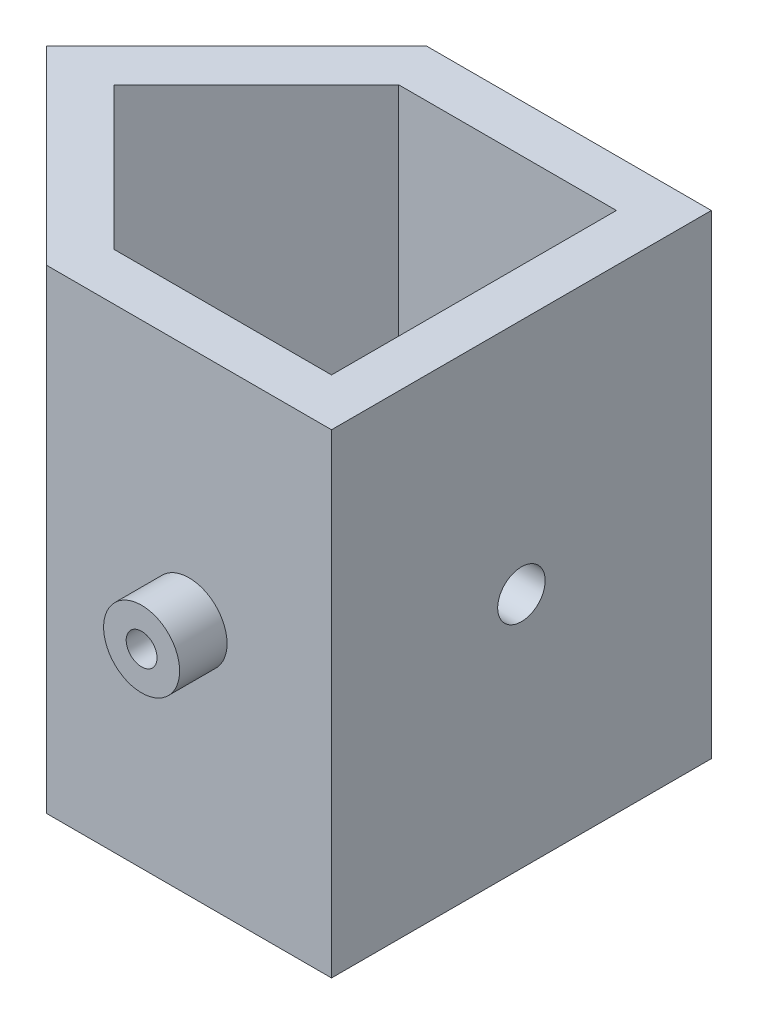
ISO-10303-21;
HEADER;
FILE_DESCRIPTION(('STEP AP214'),'2;1');
FILE_NAME('part.step','',(''),(''),'','','');
FILE_SCHEMA(('AUTOMOTIVE_DESIGN { 1 0 10303 214 1 1 1 1 }'));
ENDSEC;
DATA;
#1=APPLICATION_CONTEXT('core data for automotive mechanical design processes');
#2=APPLICATION_PROTOCOL_DEFINITION('international standard','automotive_design',2000,#1);
#3=PRODUCT_CONTEXT('',#1,'mechanical');
#4=PRODUCT('Part','Part','',(#3));
#5=PRODUCT_RELATED_PRODUCT_CATEGORY('part','',(#4));
#6=PRODUCT_DEFINITION_FORMATION('','',#4);
#7=PRODUCT_DEFINITION_CONTEXT('part definition',#1,'design');
#8=PRODUCT_DEFINITION('design','',#6,#7);
#9=PRODUCT_DEFINITION_SHAPE('','',#8);
#10=(LENGTH_UNIT() NAMED_UNIT(*) SI_UNIT(.MILLI.,.METRE.));
#11=(NAMED_UNIT(*) PLANE_ANGLE_UNIT() SI_UNIT($,.RADIAN.));
#12=(NAMED_UNIT(*) SI_UNIT($,.STERADIAN.) SOLID_ANGLE_UNIT());
#13=UNCERTAINTY_MEASURE_WITH_UNIT(LENGTH_MEASURE(1.E-05),#10,'distance_accuracy_value','');
#14=(GEOMETRIC_REPRESENTATION_CONTEXT(3) GLOBAL_UNCERTAINTY_ASSIGNED_CONTEXT((#13)) GLOBAL_UNIT_ASSIGNED_CONTEXT((#10,
#11,#12)) REPRESENTATION_CONTEXT('',''));
#15=CARTESIAN_POINT('',(0.,0.,0.));
#16=DIRECTION('',(0.,0.,1.));
#17=DIRECTION('',(1.,0.,0.));
#18=AXIS2_PLACEMENT_3D('',#15,#16,#17);
#19=CARTESIAN_POINT('',(20.0000000035894,50.,20.));
#20=DIRECTION('',(-0.707106781123095,0.,0.70710678125));
#21=DIRECTION('',(0.70710678125,0.,0.707106781123095));
#22=AXIS2_PLACEMENT_3D('',#19,#20,#21);
#23=PLANE('',#22);
#24=DIRECTION('',(-0.70710678125,0.,-0.707106781123095));
#25=VECTOR('',#24,1.);
#26=CARTESIAN_POINT('',(20.0000000035894,0.,20.));
#27=LINE('',#26,#25);
#28=CARTESIAN_POINT('',(20.0000000035894,0.,20.));
#29=VERTEX_POINT('',#28);
#30=CARTESIAN_POINT('',(0.,0.,0.));
#31=VERTEX_POINT('',#30);
#32=EDGE_CURVE('E182',#29,#31,#27,.T.);
#33=ORIENTED_EDGE('',*,*,#32,.F.);
#34=DIRECTION('',(0.,-1.,0.));
#35=VECTOR('',#34,1.);
#36=CARTESIAN_POINT('',(20.0000000035894,50.,20.));
#37=LINE('',#36,#35);
#38=CARTESIAN_POINT('',(20.0000000035894,50.,20.));
#39=VERTEX_POINT('',#38);
#40=EDGE_CURVE('E12',#39,#29,#37,.T.);
#41=ORIENTED_EDGE('',*,*,#40,.F.);
#42=DIRECTION('',(-0.70710678125,0.,-0.707106781123095));
#43=VECTOR('',#42,1.);
#44=CARTESIAN_POINT('',(20.0000000035894,50.,20.));
#45=LINE('',#44,#43);
#46=CARTESIAN_POINT('',(0.,50.,0.));
#47=VERTEX_POINT('',#46);
#48=EDGE_CURVE('E188',#39,#47,#45,.T.);
#49=ORIENTED_EDGE('',*,*,#48,.T.);
#50=DIRECTION('',(0.,-1.,0.));
#51=VECTOR('',#50,1.);
#52=CARTESIAN_POINT('',(0.,50.,0.));
#53=LINE('',#52,#51);
#54=EDGE_CURVE('E65',#47,#31,#53,.T.);
#55=ORIENTED_EDGE('',*,*,#54,.T.);
#56=EDGE_LOOP('',(#33,#41,#49,#55));
#57=FACE_BOUND('',#56,.T.);
#58=ADVANCED_FACE('F62',(#57),#23,.T.);
#59=CARTESIAN_POINT('',(50.0000000035894,50.,20.));
#60=DIRECTION('',(0.,0.,1.));
#61=DIRECTION('',(1.,0.,0.));
#62=AXIS2_PLACEMENT_3D('',#59,#60,#61);
#63=PLANE('',#62);
#64=CARTESIAN_POINT('',(35.0000000035894,25.,20.));
#65=DIRECTION('',(0.,0.,1.));
#66=DIRECTION('',(1.,0.,0.));
#67=AXIS2_PLACEMENT_3D('',#64,#65,#66);
#68=CIRCLE('',#67,4.00000000000001);
#69=CARTESIAN_POINT('',(39.0000000035894,25.,20.));
#70=VERTEX_POINT('',#69);
#71=EDGE_CURVE('E444',#70,#70,#68,.T.);
#72=ORIENTED_EDGE('',*,*,#71,.F.);
#73=EDGE_LOOP('',(#72));
#74=FACE_BOUND('',#73,.T.);
#75=DIRECTION('',(-1.,0.,0.));
#76=VECTOR('',#75,1.);
#77=CARTESIAN_POINT('',(50.0000000035894,0.,20.));
#78=LINE('',#77,#76);
#79=CARTESIAN_POINT('',(50.0000000035894,0.,20.));
#80=VERTEX_POINT('',#79);
#81=EDGE_CURVE('E192',#80,#29,#78,.T.);
#82=ORIENTED_EDGE('',*,*,#81,.F.);
#83=DIRECTION('',(0.,-1.,0.));
#84=VECTOR('',#83,1.);
#85=CARTESIAN_POINT('',(50.0000000035894,50.,20.));
#86=LINE('',#85,#84);
#87=CARTESIAN_POINT('',(50.0000000035894,50.,20.));
#88=VERTEX_POINT('',#87);
#89=EDGE_CURVE('E70',#88,#80,#86,.T.);
#90=ORIENTED_EDGE('',*,*,#89,.F.);
#91=DIRECTION('',(-1.,0.,0.));
#92=VECTOR('',#91,1.);
#93=CARTESIAN_POINT('',(50.0000000035894,50.,20.));
#94=LINE('',#93,#92);
#95=EDGE_CURVE('E201',#88,#39,#94,.T.);
#96=ORIENTED_EDGE('',*,*,#95,.T.);
#97=ORIENTED_EDGE('',*,*,#40,.T.);
#98=EDGE_LOOP('',(#82,#90,#96,#97));
#99=FACE_BOUND('',#98,.T.);
#100=ADVANCED_FACE('F233',(#74,#99),#63,.T.);
#101=CARTESIAN_POINT('',(50.0000000035894,50.,-20.));
#102=DIRECTION('',(1.,0.,0.));
#103=DIRECTION('',(0.,0.,-1.));
#104=AXIS2_PLACEMENT_3D('',#101,#102,#103);
#105=PLANE('',#104);
#106=CARTESIAN_POINT('',(50.0000000035894,25.,0.));
#107=DIRECTION('',(1.,0.,0.));
#108=DIRECTION('',(0.,0.,-1.));
#109=AXIS2_PLACEMENT_3D('',#106,#107,#108);
#110=CIRCLE('',#109,2.5);
#111=CARTESIAN_POINT('',(50.0000000035894,25.,-2.5));
#112=VERTEX_POINT('',#111);
#113=EDGE_CURVE('E164',#112,#112,#110,.T.);
#114=ORIENTED_EDGE('',*,*,#113,.F.);
#115=EDGE_LOOP('',(#114));
#116=FACE_BOUND('',#115,.T.);
#117=DIRECTION('',(0.,0.,1.));
#118=VECTOR('',#117,1.);
#119=CARTESIAN_POINT('',(50.0000000035894,0.,-20.));
#120=LINE('',#119,#118);
#121=CARTESIAN_POINT('',(50.0000000035894,0.,-20.));
#122=VERTEX_POINT('',#121);
#123=EDGE_CURVE('E212',#122,#80,#120,.T.);
#124=ORIENTED_EDGE('',*,*,#123,.F.);
#125=DIRECTION('',(0.,-1.,0.));
#126=VECTOR('',#125,1.);
#127=CARTESIAN_POINT('',(50.0000000035894,50.,-20.));
#128=LINE('',#127,#126);
#129=CARTESIAN_POINT('',(50.0000000035894,50.,-20.));
#130=VERTEX_POINT('',#129);
#131=EDGE_CURVE('E218',#130,#122,#128,.T.);
#132=ORIENTED_EDGE('',*,*,#131,.F.);
#133=DIRECTION('',(0.,0.,1.));
#134=VECTOR('',#133,1.);
#135=CARTESIAN_POINT('',(50.0000000035894,50.,-20.));
#136=LINE('',#135,#134);
#137=EDGE_CURVE('E198',#130,#88,#136,.T.);
#138=ORIENTED_EDGE('',*,*,#137,.T.);
#139=ORIENTED_EDGE('',*,*,#89,.T.);
#140=EDGE_LOOP('',(#124,#132,#138,#139));
#141=FACE_BOUND('',#140,.T.);
#142=ADVANCED_FACE('F240',(#116,#141),#105,.T.);
#143=CARTESIAN_POINT('',(20.0000000035894,50.,-20.));
#144=DIRECTION('',(0.,0.,-1.));
#145=DIRECTION('',(-1.,0.,0.));
#146=AXIS2_PLACEMENT_3D('',#143,#144,#145);
#147=PLANE('',#146);
#148=CARTESIAN_POINT('',(35.0000000035894,25.,-20.));
#149=DIRECTION('',(0.,0.,-1.));
#150=DIRECTION('',(-1.,0.,0.));
#151=AXIS2_PLACEMENT_3D('',#148,#149,#150);
#152=CIRCLE('',#151,4.);
#153=CARTESIAN_POINT('',(31.0000000035894,25.,-20.));
#154=VERTEX_POINT('',#153);
#155=EDGE_CURVE('E450',#154,#154,#152,.T.);
#156=ORIENTED_EDGE('',*,*,#155,.F.);
#157=EDGE_LOOP('',(#156));
#158=FACE_BOUND('',#157,.T.);
#159=DIRECTION('',(1.,0.,0.));
#160=VECTOR('',#159,1.);
#161=CARTESIAN_POINT('',(20.0000000035894,0.,-20.));
#162=LINE('',#161,#160);
#163=CARTESIAN_POINT('',(20.0000000035894,0.,-20.));
#164=VERTEX_POINT('',#163);
#165=EDGE_CURVE('E209',#164,#122,#162,.T.);
#166=ORIENTED_EDGE('',*,*,#165,.F.);
#167=DIRECTION('',(0.,-1.,0.));
#168=VECTOR('',#167,1.);
#169=CARTESIAN_POINT('',(20.0000000035894,50.,-20.));
#170=LINE('',#169,#168);
#171=CARTESIAN_POINT('',(20.0000000035894,50.,-20.));
#172=VERTEX_POINT('',#171);
#173=EDGE_CURVE('E219',#172,#164,#170,.T.);
#174=ORIENTED_EDGE('',*,*,#173,.F.);
#175=DIRECTION('',(1.,0.,0.));
#176=VECTOR('',#175,1.);
#177=CARTESIAN_POINT('',(20.0000000035894,50.,-20.));
#178=LINE('',#177,#176);
#179=EDGE_CURVE('E195',#172,#130,#178,.T.);
#180=ORIENTED_EDGE('',*,*,#179,.T.);
#181=ORIENTED_EDGE('',*,*,#131,.T.);
#182=EDGE_LOOP('',(#166,#174,#180,#181));
#183=FACE_BOUND('',#182,.T.);
#184=ADVANCED_FACE('F238',(#158,#183),#147,.T.);
#185=CARTESIAN_POINT('',(0.,50.,0.));
#186=DIRECTION('',(-0.707106781123095,0.,-0.70710678125));
#187=DIRECTION('',(-0.70710678125,0.,0.707106781123095));
#188=AXIS2_PLACEMENT_3D('',#185,#186,#187);
#189=PLANE('',#188);
#190=DIRECTION('',(0.70710678125,0.,-0.707106781123095));
#191=VECTOR('',#190,1.);
#192=CARTESIAN_POINT('',(0.,0.,0.));
#193=LINE('',#192,#191);
#194=EDGE_CURVE('E206',#31,#164,#193,.T.);
#195=ORIENTED_EDGE('',*,*,#194,.F.);
#196=ORIENTED_EDGE('',*,*,#54,.F.);
#197=DIRECTION('',(0.70710678125,0.,-0.707106781123095));
#198=VECTOR('',#197,1.);
#199=CARTESIAN_POINT('',(0.,50.,0.));
#200=LINE('',#199,#198);
#201=EDGE_CURVE('E191',#47,#172,#200,.T.);
#202=ORIENTED_EDGE('',*,*,#201,.T.);
#203=ORIENTED_EDGE('',*,*,#173,.T.);
#204=EDGE_LOOP('',(#195,#196,#202,#203));
#205=FACE_BOUND('',#204,.T.);
#206=ADVANCED_FACE('F227',(#205),#189,.T.);
#207=CARTESIAN_POINT('',(0.,50.,0.));
#208=DIRECTION('',(0.,-1.,0.));
#209=DIRECTION('',(0.,0.,-1.));
#210=AXIS2_PLACEMENT_3D('',#207,#208,#209);
#211=PLANE('',#210);
#212=DIRECTION('',(0.,0.,1.));
#213=VECTOR('',#212,1.);
#214=CARTESIAN_POINT('',(45.0000000035894,50.,-15.));
#215=LINE('',#214,#213);
#216=CARTESIAN_POINT('',(45.0000000035894,50.,-15.));
#217=VERTEX_POINT('',#216);
#218=CARTESIAN_POINT('',(45.0000000035894,50.,15.));
#219=VERTEX_POINT('',#218);
#220=EDGE_CURVE('E147',#217,#219,#215,.T.);
#221=ORIENTED_EDGE('',*,*,#220,.T.);
#222=DIRECTION('',(-1.,0.,0.));
#223=VECTOR('',#222,1.);
#224=CARTESIAN_POINT('',(45.0000000035894,50.,15.));
#225=LINE('',#224,#223);
#226=CARTESIAN_POINT('',(22.0710678151921,50.,15.));
#227=VERTEX_POINT('',#226);
#228=EDGE_CURVE('E141',#219,#227,#225,.T.);
#229=ORIENTED_EDGE('',*,*,#228,.T.);
#230=DIRECTION('',(-0.70710678125,0.,-0.707106781123095));
#231=VECTOR('',#230,1.);
#232=CARTESIAN_POINT('',(22.0710678151921,50.,15.));
#233=LINE('',#232,#231);
#234=CARTESIAN_POINT('',(7.07106781073223,50.,-1.76776345298113E-09));
#235=VERTEX_POINT('',#234);
#236=EDGE_CURVE('E150',#227,#235,#233,.T.);
#237=ORIENTED_EDGE('',*,*,#236,.T.);
#238=DIRECTION('',(0.707106781416667,0.,-0.707106780956428));
#239=VECTOR('',#238,1.);
#240=CARTESIAN_POINT('',(7.07106781073223,50.,-1.767766380327E-09));
#241=LINE('',#240,#239);
#242=CARTESIAN_POINT('',(22.0710678187276,50.,-15.));
#243=VERTEX_POINT('',#242);
#244=EDGE_CURVE('E78',#235,#243,#241,.T.);
#245=ORIENTED_EDGE('',*,*,#244,.T.);
#246=DIRECTION('',(1.,0.,0.));
#247=VECTOR('',#246,1.);
#248=CARTESIAN_POINT('',(22.0710678187276,50.,-15.));
#249=LINE('',#248,#247);
#250=EDGE_CURVE('E168',#243,#217,#249,.T.);
#251=ORIENTED_EDGE('',*,*,#250,.T.);
#252=EDGE_LOOP('',(#221,#229,#237,#245,#251));
#253=FACE_BOUND('',#252,.T.);
#254=ORIENTED_EDGE('',*,*,#48,.F.);
#255=ORIENTED_EDGE('',*,*,#95,.F.);
#256=ORIENTED_EDGE('',*,*,#137,.F.);
#257=ORIENTED_EDGE('',*,*,#179,.F.);
#258=ORIENTED_EDGE('',*,*,#201,.F.);
#259=EDGE_LOOP('',(#254,#255,#256,#257,#258));
#260=FACE_BOUND('',#259,.T.);
#261=ADVANCED_FACE('F154',(#253,#260),#211,.F.);
#262=CARTESIAN_POINT('',(0.,0.,0.));
#263=DIRECTION('',(0.,-1.,0.));
#264=DIRECTION('',(0.,0.,-1.));
#265=AXIS2_PLACEMENT_3D('',#262,#263,#264);
#266=PLANE('',#265);
#267=DIRECTION('',(-1.,0.,0.));
#268=VECTOR('',#267,1.);
#269=CARTESIAN_POINT('',(45.0000000035894,0.,15.));
#270=LINE('',#269,#268);
#271=CARTESIAN_POINT('',(45.0000000035894,0.,15.));
#272=VERTEX_POINT('',#271);
#273=CARTESIAN_POINT('',(22.0710678151921,0.,15.));
#274=VERTEX_POINT('',#273);
#275=EDGE_CURVE('E86',#272,#274,#270,.T.);
#276=ORIENTED_EDGE('',*,*,#275,.F.);
#277=DIRECTION('',(0.,0.,1.));
#278=VECTOR('',#277,1.);
#279=CARTESIAN_POINT('',(45.0000000035894,0.,-15.));
#280=LINE('',#279,#278);
#281=CARTESIAN_POINT('',(45.0000000035894,0.,-15.));
#282=VERTEX_POINT('',#281);
#283=EDGE_CURVE('E158',#282,#272,#280,.T.);
#284=ORIENTED_EDGE('',*,*,#283,.F.);
#285=DIRECTION('',(1.,0.,0.));
#286=VECTOR('',#285,1.);
#287=CARTESIAN_POINT('',(22.0710678187276,0.,-15.));
#288=LINE('',#287,#286);
#289=CARTESIAN_POINT('',(22.0710678187276,0.,-15.));
#290=VERTEX_POINT('',#289);
#291=EDGE_CURVE('E161',#290,#282,#288,.T.);
#292=ORIENTED_EDGE('',*,*,#291,.F.);
#293=DIRECTION('',(0.707106781416667,0.,-0.707106780956428));
#294=VECTOR('',#293,1.);
#295=CARTESIAN_POINT('',(7.07106781073223,0.,-1.767766380327E-09));
#296=LINE('',#295,#294);
#297=CARTESIAN_POINT('',(7.07106781073223,0.,-1.767766380327E-09));
#298=VERTEX_POINT('',#297);
#299=EDGE_CURVE('E175',#298,#290,#296,.T.);
#300=ORIENTED_EDGE('',*,*,#299,.F.);
#301=DIRECTION('',(-0.70710678125,0.,-0.707106781123095));
#302=VECTOR('',#301,1.);
#303=CARTESIAN_POINT('',(22.0710678151921,0.,15.));
#304=LINE('',#303,#302);
#305=EDGE_CURVE('E172',#274,#298,#304,.T.);
#306=ORIENTED_EDGE('',*,*,#305,.F.);
#307=EDGE_LOOP('',(#276,#284,#292,#300,#306));
#308=FACE_BOUND('',#307,.T.);
#309=ORIENTED_EDGE('',*,*,#32,.T.);
#310=ORIENTED_EDGE('',*,*,#194,.T.);
#311=ORIENTED_EDGE('',*,*,#165,.T.);
#312=ORIENTED_EDGE('',*,*,#123,.T.);
#313=ORIENTED_EDGE('',*,*,#81,.T.);
#314=EDGE_LOOP('',(#309,#310,#311,#312,#313));
#315=FACE_BOUND('',#314,.T.);
#316=ADVANCED_FACE('F229',(#308,#315),#266,.T.);
#317=CARTESIAN_POINT('',(45.0000000035894,50.,15.));
#318=DIRECTION('',(0.,0.,1.));
#319=DIRECTION('',(1.,0.,0.));
#320=AXIS2_PLACEMENT_3D('',#317,#318,#319);
#321=PLANE('',#320);
#322=ORIENTED_EDGE('',*,*,#275,.T.);
#323=DIRECTION('',(0.,-1.,0.));
#324=VECTOR('',#323,1.);
#325=CARTESIAN_POINT('',(22.0710678151921,50.,15.));
#326=LINE('',#325,#324);
#327=EDGE_CURVE('E137',#227,#274,#326,.T.);
#328=ORIENTED_EDGE('',*,*,#327,.F.);
#329=ORIENTED_EDGE('',*,*,#228,.F.);
#330=DIRECTION('',(0.,-1.,0.));
#331=VECTOR('',#330,1.);
#332=CARTESIAN_POINT('',(45.0000000035894,50.,15.));
#333=LINE('',#332,#331);
#334=EDGE_CURVE('E180',#219,#272,#333,.T.);
#335=ORIENTED_EDGE('',*,*,#334,.T.);
#336=EDGE_LOOP('',(#322,#328,#329,#335));
#337=FACE_BOUND('',#336,.T.);
#338=ADVANCED_FACE('F139',(#337),#321,.F.);
#339=CARTESIAN_POINT('',(45.0000000035894,50.,-15.));
#340=DIRECTION('',(1.,0.,0.));
#341=DIRECTION('',(0.,0.,-1.));
#342=AXIS2_PLACEMENT_3D('',#339,#340,#341);
#343=PLANE('',#342);
#344=CARTESIAN_POINT('',(45.0000000035894,25.,0.));
#345=DIRECTION('',(1.,0.,0.));
#346=DIRECTION('',(0.,0.,-1.));
#347=AXIS2_PLACEMENT_3D('',#344,#345,#346);
#348=CIRCLE('',#347,2.5);
#349=CARTESIAN_POINT('',(45.0000000035894,25.,-2.5));
#350=VERTEX_POINT('',#349);
#351=EDGE_CURVE('E173',#350,#350,#348,.T.);
#352=ORIENTED_EDGE('',*,*,#351,.T.);
#353=EDGE_LOOP('',(#352));
#354=FACE_BOUND('',#353,.T.);
#355=ORIENTED_EDGE('',*,*,#283,.T.);
#356=ORIENTED_EDGE('',*,*,#334,.F.);
#357=ORIENTED_EDGE('',*,*,#220,.F.);
#358=DIRECTION('',(0.,-1.,0.));
#359=VECTOR('',#358,1.);
#360=CARTESIAN_POINT('',(45.0000000035894,50.,-15.));
#361=LINE('',#360,#359);
#362=EDGE_CURVE('E183',#217,#282,#361,.T.);
#363=ORIENTED_EDGE('',*,*,#362,.T.);
#364=EDGE_LOOP('',(#355,#356,#357,#363));
#365=FACE_BOUND('',#364,.T.);
#366=ADVANCED_FACE('F364',(#354,#365),#343,.F.);
#367=CARTESIAN_POINT('',(22.0710678187276,50.,-15.));
#368=DIRECTION('',(0.,0.,-1.));
#369=DIRECTION('',(-1.,0.,0.));
#370=AXIS2_PLACEMENT_3D('',#367,#368,#369);
#371=PLANE('',#370);
#372=ORIENTED_EDGE('',*,*,#291,.T.);
#373=ORIENTED_EDGE('',*,*,#362,.F.);
#374=ORIENTED_EDGE('',*,*,#250,.F.);
#375=DIRECTION('',(0.,-1.,0.));
#376=VECTOR('',#375,1.);
#377=CARTESIAN_POINT('',(22.0710678187276,50.,-15.));
#378=LINE('',#377,#376);
#379=EDGE_CURVE('E185',#243,#290,#378,.T.);
#380=ORIENTED_EDGE('',*,*,#379,.T.);
#381=EDGE_LOOP('',(#372,#373,#374,#380));
#382=FACE_BOUND('',#381,.T.);
#383=ADVANCED_FACE('F367',(#382),#371,.F.);
#384=CARTESIAN_POINT('',(7.07106781073223,50.,-1.767766380327E-09));
#385=DIRECTION('',(-0.707106780956428,0.,-0.707106781416667));
#386=DIRECTION('',(-0.707106781416667,0.,0.707106780956428));
#387=AXIS2_PLACEMENT_3D('',#384,#385,#386);
#388=PLANE('',#387);
#389=ORIENTED_EDGE('',*,*,#299,.T.);
#390=ORIENTED_EDGE('',*,*,#379,.F.);
#391=ORIENTED_EDGE('',*,*,#244,.F.);
#392=DIRECTION('',(0.,-1.,0.));
#393=VECTOR('',#392,1.);
#394=CARTESIAN_POINT('',(7.07106781073223,50.,-1.767766380327E-09));
#395=LINE('',#394,#393);
#396=EDGE_CURVE('E146',#235,#298,#395,.T.);
#397=ORIENTED_EDGE('',*,*,#396,.T.);
#398=EDGE_LOOP('',(#389,#390,#391,#397));
#399=FACE_BOUND('',#398,.T.);
#400=ADVANCED_FACE('F371',(#399),#388,.F.);
#401=CARTESIAN_POINT('',(22.0710678151921,50.,15.));
#402=DIRECTION('',(-0.707106781123095,0.,0.70710678125));
#403=DIRECTION('',(0.70710678125,0.,0.707106781123095));
#404=AXIS2_PLACEMENT_3D('',#401,#402,#403);
#405=PLANE('',#404);
#406=ORIENTED_EDGE('',*,*,#305,.T.);
#407=ORIENTED_EDGE('',*,*,#396,.F.);
#408=ORIENTED_EDGE('',*,*,#236,.F.);
#409=ORIENTED_EDGE('',*,*,#327,.T.);
#410=EDGE_LOOP('',(#406,#407,#408,#409));
#411=FACE_BOUND('',#410,.T.);
#412=ADVANCED_FACE('F151',(#411),#405,.F.);
#413=CARTESIAN_POINT('',(45.0000000035894,25.,0.));
#414=DIRECTION('',(1.,0.,0.));
#415=DIRECTION('',(0.,0.,-1.));
#416=AXIS2_PLACEMENT_3D('',#413,#414,#415);
#417=CYLINDRICAL_SURFACE('',#416,2.5);
#418=ORIENTED_EDGE('',*,*,#351,.F.);
#419=EDGE_LOOP('',(#418));
#420=FACE_BOUND('',#419,.T.);
#421=ORIENTED_EDGE('',*,*,#113,.T.);
#422=EDGE_LOOP('',(#421));
#423=FACE_BOUND('',#422,.T.);
#424=ADVANCED_FACE('F268',(#420,#423),#417,.F.);
#425=CARTESIAN_POINT('',(35.0000000035894,25.,25.));
#426=DIRECTION('',(0.,0.,-1.));
#427=DIRECTION('',(-1.,0.,0.));
#428=AXIS2_PLACEMENT_3D('',#425,#426,#427);
#429=CYLINDRICAL_SURFACE('',#428,4.00000000000001);
#430=CARTESIAN_POINT('',(35.0000000035894,25.,25.));
#431=DIRECTION('',(0.,0.,1.));
#432=DIRECTION('',(1.,0.,0.));
#433=AXIS2_PLACEMENT_3D('',#430,#431,#432);
#434=CIRCLE('',#433,4.00000000000001);
#435=CARTESIAN_POINT('',(39.0000000035894,25.,25.));
#436=VERTEX_POINT('',#435);
#437=EDGE_CURVE('E442',#436,#436,#434,.T.);
#438=ORIENTED_EDGE('',*,*,#437,.F.);
#439=EDGE_LOOP('',(#438));
#440=FACE_BOUND('',#439,.T.);
#441=ORIENTED_EDGE('',*,*,#71,.T.);
#442=EDGE_LOOP('',(#441));
#443=FACE_BOUND('',#442,.T.);
#444=ADVANCED_FACE('F273',(#440,#443),#429,.T.);
#445=CARTESIAN_POINT('',(35.0000000035894,25.,25.));
#446=DIRECTION('',(0.,0.,1.));
#447=DIRECTION('',(1.,0.,0.));
#448=AXIS2_PLACEMENT_3D('',#445,#446,#447);
#449=PLANE('',#448);
#450=CARTESIAN_POINT('',(35.0000000035894,25.,25.));
#451=DIRECTION('',(0.,0.,1.));
#452=DIRECTION('',(1.,0.,0.));
#453=AXIS2_PLACEMENT_3D('',#450,#451,#452);
#454=CIRCLE('',#453,1.625);
#455=CARTESIAN_POINT('',(36.6250000035894,25.,25.));
#456=VERTEX_POINT('',#455);
#457=EDGE_CURVE('E456',#456,#456,#454,.T.);
#458=ORIENTED_EDGE('',*,*,#457,.F.);
#459=EDGE_LOOP('',(#458));
#460=FACE_BOUND('',#459,.T.);
#461=ORIENTED_EDGE('',*,*,#437,.T.);
#462=EDGE_LOOP('',(#461));
#463=FACE_BOUND('',#462,.T.);
#464=ADVANCED_FACE('F278',(#460,#463),#449,.T.);
#465=CARTESIAN_POINT('',(35.0000000035894,25.,-25.));
#466=DIRECTION('',(0.,0.,1.));
#467=DIRECTION('',(1.,0.,0.));
#468=AXIS2_PLACEMENT_3D('',#465,#466,#467);
#469=CYLINDRICAL_SURFACE('',#468,4.);
#470=CARTESIAN_POINT('',(35.0000000035894,25.,-25.));
#471=DIRECTION('',(0.,0.,-1.));
#472=DIRECTION('',(-1.,0.,0.));
#473=AXIS2_PLACEMENT_3D('',#470,#471,#472);
#474=CIRCLE('',#473,4.);
#475=CARTESIAN_POINT('',(31.0000000035894,25.,-25.));
#476=VERTEX_POINT('',#475);
#477=EDGE_CURVE('E447',#476,#476,#474,.T.);
#478=ORIENTED_EDGE('',*,*,#477,.F.);
#479=EDGE_LOOP('',(#478));
#480=FACE_BOUND('',#479,.T.);
#481=ORIENTED_EDGE('',*,*,#155,.T.);
#482=EDGE_LOOP('',(#481));
#483=FACE_BOUND('',#482,.T.);
#484=ADVANCED_FACE('F294',(#480,#483),#469,.T.);
#485=CARTESIAN_POINT('',(35.0000000035894,25.,-25.));
#486=DIRECTION('',(0.,0.,-1.));
#487=DIRECTION('',(-1.,0.,0.));
#488=AXIS2_PLACEMENT_3D('',#485,#486,#487);
#489=PLANE('',#488);
#490=CARTESIAN_POINT('',(35.0000000035894,25.,-25.));
#491=DIRECTION('',(0.,0.,-1.));
#492=DIRECTION('',(-1.,0.,0.));
#493=AXIS2_PLACEMENT_3D('',#490,#491,#492);
#494=CIRCLE('',#493,1.625);
#495=CARTESIAN_POINT('',(33.3750000035894,25.,-25.));
#496=VERTEX_POINT('',#495);
#497=EDGE_CURVE('E462',#496,#496,#494,.T.);
#498=ORIENTED_EDGE('',*,*,#497,.F.);
#499=EDGE_LOOP('',(#498));
#500=FACE_BOUND('',#499,.T.);
#501=ORIENTED_EDGE('',*,*,#477,.T.);
#502=EDGE_LOOP('',(#501));
#503=FACE_BOUND('',#502,.T.);
#504=ADVANCED_FACE('F299',(#500,#503),#489,.T.);
#505=CARTESIAN_POINT('',(35.0000000035894,25.,19.));
#506=DIRECTION('',(0.,0.,1.));
#507=DIRECTION('',(1.,0.,0.));
#508=AXIS2_PLACEMENT_3D('',#505,#506,#507);
#509=CYLINDRICAL_SURFACE('',#508,1.625);
#510=CARTESIAN_POINT('',(35.0000000035894,25.,19.));
#511=DIRECTION('',(0.,0.,1.));
#512=DIRECTION('',(1.,0.,0.));
#513=AXIS2_PLACEMENT_3D('',#510,#511,#512);
#514=CIRCLE('',#513,1.625);
#515=CARTESIAN_POINT('',(36.6250000035894,25.,19.));
#516=VERTEX_POINT('',#515);
#517=EDGE_CURVE('E453',#516,#516,#514,.T.);
#518=ORIENTED_EDGE('',*,*,#517,.F.);
#519=EDGE_LOOP('',(#518));
#520=FACE_BOUND('',#519,.T.);
#521=ORIENTED_EDGE('',*,*,#457,.T.);
#522=EDGE_LOOP('',(#521));
#523=FACE_BOUND('',#522,.T.);
#524=ADVANCED_FACE('F314',(#520,#523),#509,.F.);
#525=CARTESIAN_POINT('',(35.0000000035894,25.,19.));
#526=DIRECTION('',(0.,0.,1.));
#527=DIRECTION('',(1.,0.,0.));
#528=AXIS2_PLACEMENT_3D('',#525,#526,#527);
#529=PLANE('',#528);
#530=ORIENTED_EDGE('',*,*,#517,.T.);
#531=EDGE_LOOP('',(#530));
#532=FACE_BOUND('',#531,.T.);
#533=ADVANCED_FACE('F319',(#532),#529,.T.);
#534=CARTESIAN_POINT('',(35.0000000035894,25.,-19.));
#535=DIRECTION('',(0.,0.,-1.));
#536=DIRECTION('',(-1.,0.,0.));
#537=AXIS2_PLACEMENT_3D('',#534,#535,#536);
#538=CYLINDRICAL_SURFACE('',#537,1.625);
#539=CARTESIAN_POINT('',(35.0000000035894,25.,-19.));
#540=DIRECTION('',(0.,0.,-1.));
#541=DIRECTION('',(-1.,0.,0.));
#542=AXIS2_PLACEMENT_3D('',#539,#540,#541);
#543=CIRCLE('',#542,1.625);
#544=CARTESIAN_POINT('',(33.3750000035894,25.,-19.));
#545=VERTEX_POINT('',#544);
#546=EDGE_CURVE('E459',#545,#545,#543,.T.);
#547=ORIENTED_EDGE('',*,*,#546,.F.);
#548=EDGE_LOOP('',(#547));
#549=FACE_BOUND('',#548,.T.);
#550=ORIENTED_EDGE('',*,*,#497,.T.);
#551=EDGE_LOOP('',(#550));
#552=FACE_BOUND('',#551,.T.);
#553=ADVANCED_FACE('F329',(#549,#552),#538,.F.);
#554=CARTESIAN_POINT('',(35.0000000035894,25.,-19.));
#555=DIRECTION('',(0.,0.,-1.));
#556=DIRECTION('',(-1.,0.,0.));
#557=AXIS2_PLACEMENT_3D('',#554,#555,#556);
#558=PLANE('',#557);
#559=ORIENTED_EDGE('',*,*,#546,.T.);
#560=EDGE_LOOP('',(#559));
#561=FACE_BOUND('',#560,.T.);
#562=ADVANCED_FACE('F346',(#561),#558,.T.);
#563=CLOSED_SHELL('',(#58,#100,#142,#184,#206,#261,#316,#338,#366,#383,#400,#412,#424,#444,#464,
#484,#504,#524,#533,#553,#562));
#564=MANIFOLD_SOLID_BREP('B2',#563);
#565=ADVANCED_BREP_SHAPE_REPRESENTATION('',(#18,#564),#14);
#566=SHAPE_DEFINITION_REPRESENTATION(#9,#565);
ENDSEC;
END-ISO-10303-21;
